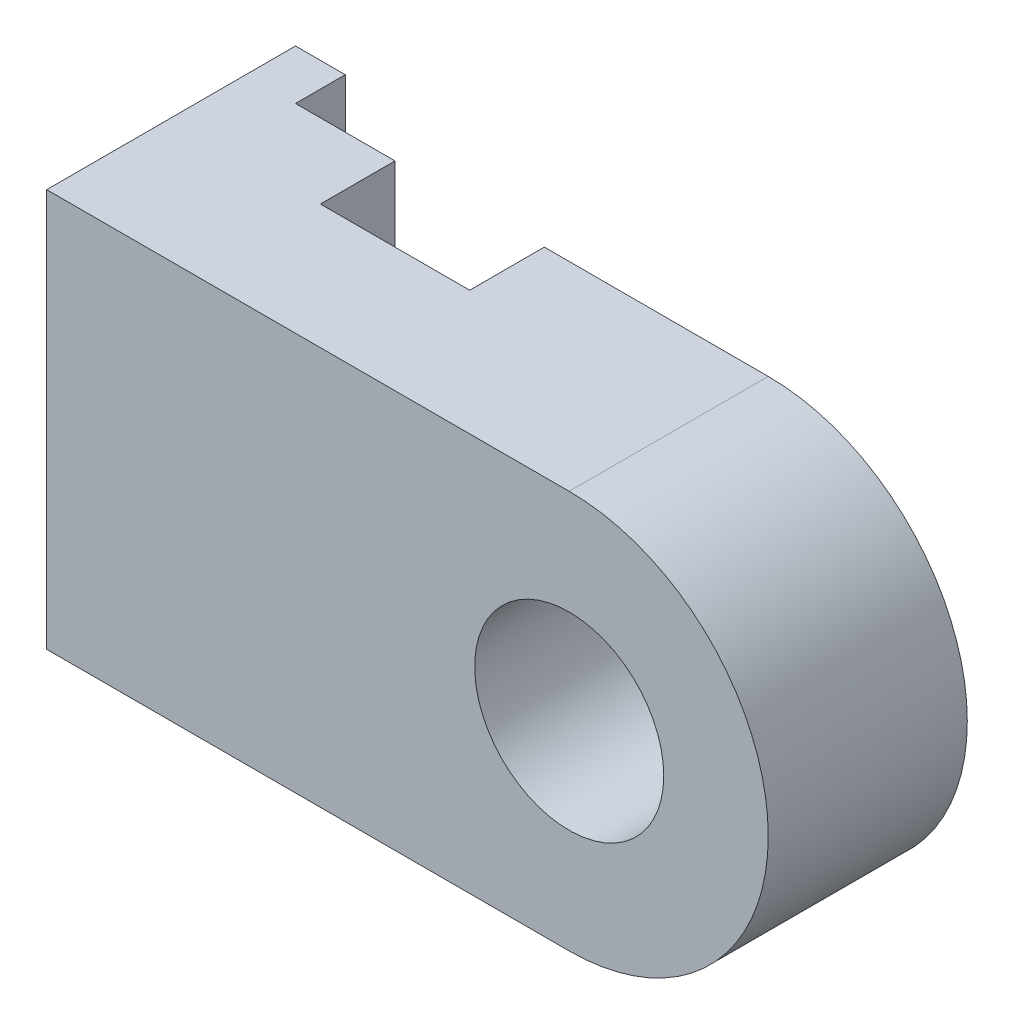
ISO-10303-21;
HEADER;
FILE_DESCRIPTION(('STEP AP214'),'2;1');
FILE_NAME('part.step','',(''),(''),'','','');
FILE_SCHEMA(('AUTOMOTIVE_DESIGN { 1 0 10303 214 1 1 1 1 }'));
ENDSEC;
DATA;
#1=APPLICATION_CONTEXT('core data for automotive mechanical design processes');
#2=APPLICATION_PROTOCOL_DEFINITION('international standard','automotive_design',2000,#1);
#3=PRODUCT_CONTEXT('',#1,'mechanical');
#4=PRODUCT('Part','Part','',(#3));
#5=PRODUCT_RELATED_PRODUCT_CATEGORY('part','',(#4));
#6=PRODUCT_DEFINITION_FORMATION('','',#4);
#7=PRODUCT_DEFINITION_CONTEXT('part definition',#1,'design');
#8=PRODUCT_DEFINITION('design','',#6,#7);
#9=PRODUCT_DEFINITION_SHAPE('','',#8);
#10=(LENGTH_UNIT() NAMED_UNIT(*) SI_UNIT(.MILLI.,.METRE.));
#11=(NAMED_UNIT(*) PLANE_ANGLE_UNIT() SI_UNIT($,.RADIAN.));
#12=(NAMED_UNIT(*) SI_UNIT($,.STERADIAN.) SOLID_ANGLE_UNIT());
#13=UNCERTAINTY_MEASURE_WITH_UNIT(LENGTH_MEASURE(1.E-05),#10,'distance_accuracy_value','');
#14=(GEOMETRIC_REPRESENTATION_CONTEXT(3) GLOBAL_UNCERTAINTY_ASSIGNED_CONTEXT((#13)) GLOBAL_UNIT_ASSIGNED_CONTEXT((#10,
#11,#12)) REPRESENTATION_CONTEXT('',''));
#15=CARTESIAN_POINT('',(0.,0.,0.));
#16=DIRECTION('',(0.,0.,1.));
#17=DIRECTION('',(1.,0.,0.));
#18=AXIS2_PLACEMENT_3D('',#15,#16,#17);
#19=CARTESIAN_POINT('',(0.,0.,0.));
#20=DIRECTION('',(0.,0.,1.));
#21=DIRECTION('',(1.,0.,0.));
#22=AXIS2_PLACEMENT_3D('',#19,#20,#21);
#23=PLANE('',#22);
#24=DIRECTION('',(0.,-1.,0.));
#25=VECTOR('',#24,1.);
#26=CARTESIAN_POINT('',(-9.5,4.,0.));
#27=LINE('',#26,#25);
#28=CARTESIAN_POINT('',(-9.5,4.,0.));
#29=VERTEX_POINT('',#28);
#30=CARTESIAN_POINT('',(-9.5,-4.,0.));
#31=VERTEX_POINT('',#30);
#32=EDGE_CURVE('E137',#29,#31,#27,.T.);
#33=ORIENTED_EDGE('',*,*,#32,.F.);
#34=DIRECTION('',(-1.,0.,0.));
#35=VECTOR('',#34,1.);
#36=CARTESIAN_POINT('',(0.,4.,0.));
#37=LINE('',#36,#35);
#38=CARTESIAN_POINT('',(-7.5,4.,0.));
#39=VERTEX_POINT('',#38);
#40=EDGE_CURVE('E188',#39,#29,#37,.T.);
#41=ORIENTED_EDGE('',*,*,#40,.F.);
#42=DIRECTION('',(0.,1.,0.));
#43=VECTOR('',#42,1.);
#44=CARTESIAN_POINT('',(-7.5,-4.,0.));
#45=LINE('',#44,#43);
#46=CARTESIAN_POINT('',(-7.5,-4.,0.));
#47=VERTEX_POINT('',#46);
#48=EDGE_CURVE('E161',#47,#39,#45,.T.);
#49=ORIENTED_EDGE('',*,*,#48,.F.);
#50=DIRECTION('',(1.,0.,0.));
#51=VECTOR('',#50,1.);
#52=CARTESIAN_POINT('',(-10.5,-4.,0.));
#53=LINE('',#52,#51);
#54=EDGE_CURVE('E180',#31,#47,#53,.T.);
#55=ORIENTED_EDGE('',*,*,#54,.F.);
#56=EDGE_LOOP('',(#33,#41,#49,#55));
#57=FACE_BOUND('',#56,.T.);
#58=ADVANCED_FACE('F37',(#57),#23,.F.);
#59=CARTESIAN_POINT('',(0.,0.,4.));
#60=DIRECTION('',(0.,0.,1.));
#61=DIRECTION('',(1.,0.,0.));
#62=AXIS2_PLACEMENT_3D('',#59,#60,#61);
#63=PLANE('',#62);
#64=CARTESIAN_POINT('',(0.,0.,4.));
#65=DIRECTION('',(0.,0.,1.));
#66=DIRECTION('',(1.,0.,0.));
#67=AXIS2_PLACEMENT_3D('',#64,#65,#66);
#68=CIRCLE('',#67,4.);
#69=CARTESIAN_POINT('',(0.,-4.,4.));
#70=VERTEX_POINT('',#69);
#71=CARTESIAN_POINT('',(0.,4.,4.));
#72=VERTEX_POINT('',#71);
#73=EDGE_CURVE('E176',#70,#72,#68,.T.);
#74=ORIENTED_EDGE('',*,*,#73,.T.);
#75=DIRECTION('',(-1.,0.,0.));
#76=VECTOR('',#75,1.);
#77=CARTESIAN_POINT('',(0.,4.,4.));
#78=LINE('',#77,#76);
#79=CARTESIAN_POINT('',(-10.5,4.,4.));
#80=VERTEX_POINT('',#79);
#81=EDGE_CURVE('E179',#72,#80,#78,.T.);
#82=ORIENTED_EDGE('',*,*,#81,.T.);
#83=DIRECTION('',(0.,-1.,0.));
#84=VECTOR('',#83,1.);
#85=CARTESIAN_POINT('',(-10.5,4.,4.));
#86=LINE('',#85,#84);
#87=CARTESIAN_POINT('',(-10.5,-4.,4.));
#88=VERTEX_POINT('',#87);
#89=EDGE_CURVE('E121',#80,#88,#86,.T.);
#90=ORIENTED_EDGE('',*,*,#89,.T.);
#91=DIRECTION('',(1.,0.,0.));
#92=VECTOR('',#91,1.);
#93=CARTESIAN_POINT('',(-10.5,-4.,4.));
#94=LINE('',#93,#92);
#95=EDGE_CURVE('E183',#88,#70,#94,.T.);
#96=ORIENTED_EDGE('',*,*,#95,.T.);
#97=EDGE_LOOP('',(#74,#82,#90,#96));
#98=FACE_BOUND('',#97,.T.);
#99=CARTESIAN_POINT('',(0.,0.,4.));
#100=DIRECTION('',(0.,0.,1.));
#101=DIRECTION('',(1.,0.,0.));
#102=AXIS2_PLACEMENT_3D('',#99,#100,#101);
#103=CIRCLE('',#102,1.9);
#104=CARTESIAN_POINT('',(1.9,0.,4.));
#105=VERTEX_POINT('',#104);
#106=EDGE_CURVE('E170',#105,#105,#103,.T.);
#107=ORIENTED_EDGE('',*,*,#106,.F.);
#108=EDGE_LOOP('',(#107));
#109=FACE_BOUND('',#108,.T.);
#110=ADVANCED_FACE('F201',(#98,#109),#63,.T.);
#111=CARTESIAN_POINT('',(-4.5,-4.,0.));
#112=VERTEX_POINT('',#111);
#113=CARTESIAN_POINT('',(0.,-4.,0.));
#114=VERTEX_POINT('',#113);
#115=EDGE_CURVE('E192',#112,#114,#53,.T.);
#116=ORIENTED_EDGE('',*,*,#115,.F.);
#117=DIRECTION('',(0.,1.,0.));
#118=VECTOR('',#117,1.);
#119=CARTESIAN_POINT('',(-4.5,-4.,0.));
#120=LINE('',#119,#118);
#121=CARTESIAN_POINT('',(-4.5,4.,0.));
#122=VERTEX_POINT('',#121);
#123=EDGE_CURVE('E164',#112,#122,#120,.T.);
#124=ORIENTED_EDGE('',*,*,#123,.T.);
#125=CARTESIAN_POINT('',(0.,4.,0.));
#126=VERTEX_POINT('',#125);
#127=EDGE_CURVE('E189',#126,#122,#37,.T.);
#128=ORIENTED_EDGE('',*,*,#127,.F.);
#129=CARTESIAN_POINT('',(0.,0.,0.));
#130=DIRECTION('',(0.,0.,1.));
#131=DIRECTION('',(1.,0.,0.));
#132=AXIS2_PLACEMENT_3D('',#129,#130,#131);
#133=CIRCLE('',#132,4.);
#134=EDGE_CURVE('E173',#114,#126,#133,.T.);
#135=ORIENTED_EDGE('',*,*,#134,.F.);
#136=EDGE_LOOP('',(#116,#124,#128,#135));
#137=FACE_BOUND('',#136,.T.);
#138=CARTESIAN_POINT('',(0.,0.,0.));
#139=DIRECTION('',(0.,0.,1.));
#140=DIRECTION('',(1.,0.,0.));
#141=AXIS2_PLACEMENT_3D('',#138,#139,#140);
#142=CIRCLE('',#141,1.9);
#143=CARTESIAN_POINT('',(1.9,0.,0.));
#144=VERTEX_POINT('',#143);
#145=EDGE_CURVE('E163',#144,#144,#142,.T.);
#146=ORIENTED_EDGE('',*,*,#145,.T.);
#147=EDGE_LOOP('',(#146));
#148=FACE_BOUND('',#147,.T.);
#149=ADVANCED_FACE('F209',(#137,#148),#23,.F.);
#150=CARTESIAN_POINT('',(0.,0.,4.));
#151=DIRECTION('',(0.,0.,-1.));
#152=DIRECTION('',(-1.,0.,0.));
#153=AXIS2_PLACEMENT_3D('',#150,#151,#152);
#154=CYLINDRICAL_SURFACE('',#153,4.);
#155=ORIENTED_EDGE('',*,*,#134,.T.);
#156=DIRECTION('',(0.,0.,-1.));
#157=VECTOR('',#156,1.);
#158=CARTESIAN_POINT('',(0.,4.,4.));
#159=LINE('',#158,#157);
#160=EDGE_CURVE('E11',#72,#126,#159,.T.);
#161=ORIENTED_EDGE('',*,*,#160,.F.);
#162=ORIENTED_EDGE('',*,*,#73,.F.);
#163=DIRECTION('',(0.,0.,-1.));
#164=VECTOR('',#163,1.);
#165=CARTESIAN_POINT('',(0.,-4.,4.));
#166=LINE('',#165,#164);
#167=EDGE_CURVE('E185',#70,#114,#166,.T.);
#168=ORIENTED_EDGE('',*,*,#167,.T.);
#169=EDGE_LOOP('',(#155,#161,#162,#168));
#170=FACE_BOUND('',#169,.T.);
#171=ADVANCED_FACE('F39',(#170),#154,.T.);
#172=CARTESIAN_POINT('',(0.,4.,4.));
#173=DIRECTION('',(0.,-1.,0.));
#174=DIRECTION('',(1.,0.,0.));
#175=AXIS2_PLACEMENT_3D('',#172,#173,#174);
#176=PLANE('',#175);
#177=DIRECTION('',(1.,0.,0.));
#178=VECTOR('',#177,1.);
#179=CARTESIAN_POINT('',(-7.5,4.,1.5));
#180=LINE('',#179,#178);
#181=CARTESIAN_POINT('',(-7.5,4.,1.5));
#182=VERTEX_POINT('',#181);
#183=CARTESIAN_POINT('',(-4.5,4.,1.5));
#184=VERTEX_POINT('',#183);
#185=EDGE_CURVE('E157',#182,#184,#180,.T.);
#186=ORIENTED_EDGE('',*,*,#185,.F.);
#187=DIRECTION('',(0.,0.,1.));
#188=VECTOR('',#187,1.);
#189=CARTESIAN_POINT('',(-7.5,4.,0.));
#190=LINE('',#189,#188);
#191=EDGE_CURVE('E145',#39,#182,#190,.T.);
#192=ORIENTED_EDGE('',*,*,#191,.F.);
#193=ORIENTED_EDGE('',*,*,#40,.T.);
#194=DIRECTION('',(0.,0.,1.));
#195=VECTOR('',#194,1.);
#196=CARTESIAN_POINT('',(-9.5,4.,-1.));
#197=LINE('',#196,#195);
#198=CARTESIAN_POINT('',(-9.5,4.,-1.));
#199=VERTEX_POINT('',#198);
#200=EDGE_CURVE('E129',#199,#29,#197,.T.);
#201=ORIENTED_EDGE('',*,*,#200,.F.);
#202=DIRECTION('',(1.,0.,0.));
#203=VECTOR('',#202,1.);
#204=CARTESIAN_POINT('',(-10.5,4.,-1.));
#205=LINE('',#204,#203);
#206=CARTESIAN_POINT('',(-10.5,4.,-1.));
#207=VERTEX_POINT('',#206);
#208=EDGE_CURVE('E125',#207,#199,#205,.T.);
#209=ORIENTED_EDGE('',*,*,#208,.F.);
#210=DIRECTION('',(0.,0.,-1.));
#211=VECTOR('',#210,1.);
#212=CARTESIAN_POINT('',(-10.5,4.,4.));
#213=LINE('',#212,#211);
#214=EDGE_CURVE('E45',#80,#207,#213,.T.);
#215=ORIENTED_EDGE('',*,*,#214,.F.);
#216=ORIENTED_EDGE('',*,*,#81,.F.);
#217=ORIENTED_EDGE('',*,*,#160,.T.);
#218=ORIENTED_EDGE('',*,*,#127,.T.);
#219=DIRECTION('',(0.,0.,-1.));
#220=VECTOR('',#219,1.);
#221=CARTESIAN_POINT('',(-4.5,4.,0.));
#222=LINE('',#221,#220);
#223=EDGE_CURVE('E150',#184,#122,#222,.T.);
#224=ORIENTED_EDGE('',*,*,#223,.F.);
#225=EDGE_LOOP('',(#186,#192,#193,#201,#209,#215,#216,#217,#218,#224));
#226=FACE_BOUND('',#225,.T.);
#227=ADVANCED_FACE('F127',(#226),#176,.F.);
#228=CARTESIAN_POINT('',(-10.5,4.,4.));
#229=DIRECTION('',(1.,0.,0.));
#230=DIRECTION('',(0.,0.,-1.));
#231=AXIS2_PLACEMENT_3D('',#228,#229,#230);
#232=PLANE('',#231);
#233=ORIENTED_EDGE('',*,*,#214,.T.);
#234=DIRECTION('',(0.,1.,0.));
#235=VECTOR('',#234,1.);
#236=CARTESIAN_POINT('',(-10.5,4.,-1.));
#237=LINE('',#236,#235);
#238=CARTESIAN_POINT('',(-10.5,-4.,-1.));
#239=VERTEX_POINT('',#238);
#240=EDGE_CURVE('E120',#239,#207,#237,.T.);
#241=ORIENTED_EDGE('',*,*,#240,.F.);
#242=DIRECTION('',(0.,0.,-1.));
#243=VECTOR('',#242,1.);
#244=CARTESIAN_POINT('',(-10.5,-4.,4.));
#245=LINE('',#244,#243);
#246=EDGE_CURVE('E123',#88,#239,#245,.T.);
#247=ORIENTED_EDGE('',*,*,#246,.F.);
#248=ORIENTED_EDGE('',*,*,#89,.F.);
#249=EDGE_LOOP('',(#233,#241,#247,#248));
#250=FACE_BOUND('',#249,.T.);
#251=ADVANCED_FACE('F117',(#250),#232,.F.);
#252=CARTESIAN_POINT('',(-10.5,-4.,4.));
#253=DIRECTION('',(0.,1.,0.));
#254=DIRECTION('',(-1.,0.,0.));
#255=AXIS2_PLACEMENT_3D('',#252,#253,#254);
#256=PLANE('',#255);
#257=ORIENTED_EDGE('',*,*,#246,.T.);
#258=DIRECTION('',(-1.,0.,0.));
#259=VECTOR('',#258,1.);
#260=CARTESIAN_POINT('',(-10.5,-4.,-1.));
#261=LINE('',#260,#259);
#262=CARTESIAN_POINT('',(-9.5,-4.,-1.));
#263=VERTEX_POINT('',#262);
#264=EDGE_CURVE('E136',#263,#239,#261,.T.);
#265=ORIENTED_EDGE('',*,*,#264,.F.);
#266=DIRECTION('',(0.,0.,1.));
#267=VECTOR('',#266,1.);
#268=CARTESIAN_POINT('',(-9.5,-4.,-1.));
#269=LINE('',#268,#267);
#270=EDGE_CURVE('E52',#263,#31,#269,.T.);
#271=ORIENTED_EDGE('',*,*,#270,.T.);
#272=ORIENTED_EDGE('',*,*,#54,.T.);
#273=DIRECTION('',(0.,0.,1.));
#274=VECTOR('',#273,1.);
#275=CARTESIAN_POINT('',(-7.5,-4.,0.));
#276=LINE('',#275,#274);
#277=CARTESIAN_POINT('',(-7.5,-4.,1.5));
#278=VERTEX_POINT('',#277);
#279=EDGE_CURVE('E146',#47,#278,#276,.T.);
#280=ORIENTED_EDGE('',*,*,#279,.T.);
#281=DIRECTION('',(1.,0.,0.));
#282=VECTOR('',#281,1.);
#283=CARTESIAN_POINT('',(-7.5,-4.,1.5));
#284=LINE('',#283,#282);
#285=CARTESIAN_POINT('',(-4.5,-4.,1.5));
#286=VERTEX_POINT('',#285);
#287=EDGE_CURVE('E149',#278,#286,#284,.T.);
#288=ORIENTED_EDGE('',*,*,#287,.T.);
#289=DIRECTION('',(0.,0.,-1.));
#290=VECTOR('',#289,1.);
#291=CARTESIAN_POINT('',(-4.5,-4.,0.));
#292=LINE('',#291,#290);
#293=EDGE_CURVE('E60',#286,#112,#292,.T.);
#294=ORIENTED_EDGE('',*,*,#293,.T.);
#295=ORIENTED_EDGE('',*,*,#115,.T.);
#296=ORIENTED_EDGE('',*,*,#167,.F.);
#297=ORIENTED_EDGE('',*,*,#95,.F.);
#298=EDGE_LOOP('',(#257,#265,#271,#272,#280,#288,#294,#295,#296,#297));
#299=FACE_BOUND('',#298,.T.);
#300=ADVANCED_FACE('F197',(#299),#256,.F.);
#301=CARTESIAN_POINT('',(0.,0.,4.));
#302=DIRECTION('',(0.,0.,-1.));
#303=DIRECTION('',(-1.,0.,0.));
#304=AXIS2_PLACEMENT_3D('',#301,#302,#303);
#305=CYLINDRICAL_SURFACE('',#304,1.9);
#306=ORIENTED_EDGE('',*,*,#106,.T.);
#307=EDGE_LOOP('',(#306));
#308=FACE_BOUND('',#307,.T.);
#309=ORIENTED_EDGE('',*,*,#145,.F.);
#310=EDGE_LOOP('',(#309));
#311=FACE_BOUND('',#310,.T.);
#312=ADVANCED_FACE('F253',(#308,#311),#305,.F.);
#313=CARTESIAN_POINT('',(-7.5,-4.,0.));
#314=DIRECTION('',(-1.,0.,0.));
#315=DIRECTION('',(0.,-1.,0.));
#316=AXIS2_PLACEMENT_3D('',#313,#314,#315);
#317=PLANE('',#316);
#318=ORIENTED_EDGE('',*,*,#191,.T.);
#319=DIRECTION('',(0.,1.,0.));
#320=VECTOR('',#319,1.);
#321=CARTESIAN_POINT('',(-7.5,-4.,1.5));
#322=LINE('',#321,#320);
#323=EDGE_CURVE('E154',#278,#182,#322,.T.);
#324=ORIENTED_EDGE('',*,*,#323,.F.);
#325=ORIENTED_EDGE('',*,*,#279,.F.);
#326=ORIENTED_EDGE('',*,*,#48,.T.);
#327=EDGE_LOOP('',(#318,#324,#325,#326));
#328=FACE_BOUND('',#327,.T.);
#329=ADVANCED_FACE('F257',(#328),#317,.F.);
#330=CARTESIAN_POINT('',(-4.5,-4.,0.));
#331=DIRECTION('',(1.,0.,0.));
#332=DIRECTION('',(0.,1.,0.));
#333=AXIS2_PLACEMENT_3D('',#330,#331,#332);
#334=PLANE('',#333);
#335=ORIENTED_EDGE('',*,*,#223,.T.);
#336=ORIENTED_EDGE('',*,*,#123,.F.);
#337=ORIENTED_EDGE('',*,*,#293,.F.);
#338=DIRECTION('',(0.,1.,0.));
#339=VECTOR('',#338,1.);
#340=CARTESIAN_POINT('',(-4.5,-4.,1.5));
#341=LINE('',#340,#339);
#342=EDGE_CURVE('E167',#286,#184,#341,.T.);
#343=ORIENTED_EDGE('',*,*,#342,.T.);
#344=EDGE_LOOP('',(#335,#336,#337,#343));
#345=FACE_BOUND('',#344,.T.);
#346=ADVANCED_FACE('F211',(#345),#334,.F.);
#347=CARTESIAN_POINT('',(-7.5,-4.,1.5));
#348=DIRECTION('',(0.,0.,1.));
#349=DIRECTION('',(1.,0.,0.));
#350=AXIS2_PLACEMENT_3D('',#347,#348,#349);
#351=PLANE('',#350);
#352=ORIENTED_EDGE('',*,*,#185,.T.);
#353=ORIENTED_EDGE('',*,*,#342,.F.);
#354=ORIENTED_EDGE('',*,*,#287,.F.);
#355=ORIENTED_EDGE('',*,*,#323,.T.);
#356=EDGE_LOOP('',(#352,#353,#354,#355));
#357=FACE_BOUND('',#356,.T.);
#358=ADVANCED_FACE('F215',(#357),#351,.F.);
#359=CARTESIAN_POINT('',(-9.5,4.,-1.));
#360=DIRECTION('',(-1.,0.,0.));
#361=DIRECTION('',(0.,-1.,0.));
#362=AXIS2_PLACEMENT_3D('',#359,#360,#361);
#363=PLANE('',#362);
#364=ORIENTED_EDGE('',*,*,#32,.T.);
#365=ORIENTED_EDGE('',*,*,#270,.F.);
#366=DIRECTION('',(0.,-1.,0.));
#367=VECTOR('',#366,1.);
#368=CARTESIAN_POINT('',(-9.5,4.,-1.));
#369=LINE('',#368,#367);
#370=EDGE_CURVE('E132',#199,#263,#369,.T.);
#371=ORIENTED_EDGE('',*,*,#370,.F.);
#372=ORIENTED_EDGE('',*,*,#200,.T.);
#373=EDGE_LOOP('',(#364,#365,#371,#372));
#374=FACE_BOUND('',#373,.T.);
#375=ADVANCED_FACE('F224',(#374),#363,.F.);
#376=CARTESIAN_POINT('',(0.,0.,-1.));
#377=DIRECTION('',(0.,0.,1.));
#378=DIRECTION('',(1.,0.,0.));
#379=AXIS2_PLACEMENT_3D('',#376,#377,#378);
#380=PLANE('',#379);
#381=ORIENTED_EDGE('',*,*,#240,.T.);
#382=ORIENTED_EDGE('',*,*,#208,.T.);
#383=ORIENTED_EDGE('',*,*,#370,.T.);
#384=ORIENTED_EDGE('',*,*,#264,.T.);
#385=EDGE_LOOP('',(#381,#382,#383,#384));
#386=FACE_BOUND('',#385,.T.);
#387=ADVANCED_FACE('F135',(#386),#380,.F.);
#388=CLOSED_SHELL('',(#58,#110,#149,#171,#227,#251,#300,#312,#329,#346,#358,#375,#387));
#389=MANIFOLD_SOLID_BREP('B2',#388);
#390=ADVANCED_BREP_SHAPE_REPRESENTATION('',(#18,#389),#14);
#391=SHAPE_DEFINITION_REPRESENTATION(#9,#390);
ENDSEC;
END-ISO-10303-21;
